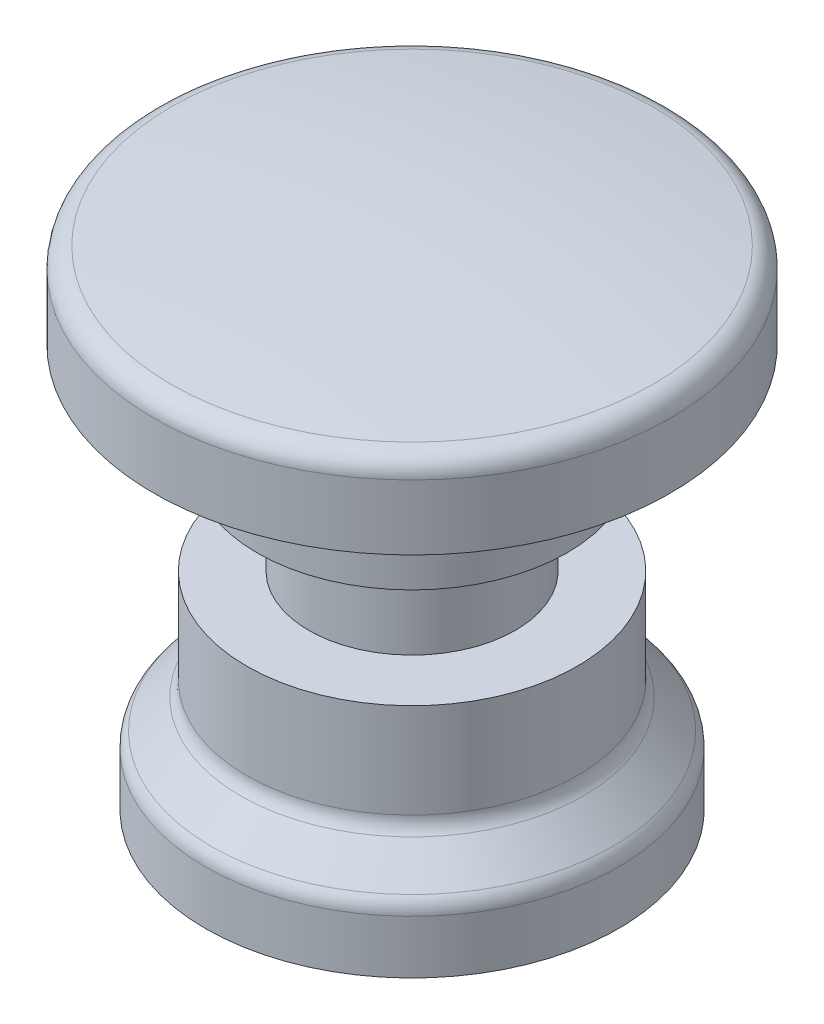
ISO-10303-21;
HEADER;
FILE_DESCRIPTION(('STEP AP214'),'2;1');
FILE_NAME('part.step','',(''),(''),'','','');
FILE_SCHEMA(('AUTOMOTIVE_DESIGN { 1 0 10303 214 1 1 1 1 }'));
ENDSEC;
DATA;
#1=APPLICATION_CONTEXT('core data for automotive mechanical design processes');
#2=APPLICATION_PROTOCOL_DEFINITION('international standard','automotive_design',2000,#1);
#3=PRODUCT_CONTEXT('',#1,'mechanical');
#4=PRODUCT('Part','Part','',(#3));
#5=PRODUCT_RELATED_PRODUCT_CATEGORY('part','',(#4));
#6=PRODUCT_DEFINITION_FORMATION('','',#4);
#7=PRODUCT_DEFINITION_CONTEXT('part definition',#1,'design');
#8=PRODUCT_DEFINITION('design','',#6,#7);
#9=PRODUCT_DEFINITION_SHAPE('','',#8);
#10=(LENGTH_UNIT() NAMED_UNIT(*) SI_UNIT(.MILLI.,.METRE.));
#11=(NAMED_UNIT(*) PLANE_ANGLE_UNIT() SI_UNIT($,.RADIAN.));
#12=(NAMED_UNIT(*) SI_UNIT($,.STERADIAN.) SOLID_ANGLE_UNIT());
#13=UNCERTAINTY_MEASURE_WITH_UNIT(LENGTH_MEASURE(1.E-05),#10,'distance_accuracy_value','');
#14=(GEOMETRIC_REPRESENTATION_CONTEXT(3) GLOBAL_UNCERTAINTY_ASSIGNED_CONTEXT((#13)) GLOBAL_UNIT_ASSIGNED_CONTEXT((#10,
#11,#12)) REPRESENTATION_CONTEXT('',''));
#15=CARTESIAN_POINT('',(0.,0.,0.));
#16=DIRECTION('',(0.,0.,1.));
#17=DIRECTION('',(1.,0.,0.));
#18=AXIS2_PLACEMENT_3D('',#15,#16,#17);
#19=CARTESIAN_POINT('',(0.,-54.125,0.));
#20=DIRECTION('',(0.,0.,1.));
#21=DIRECTION('',(1.,0.,0.));
#22=AXIS2_PLACEMENT_3D('',#19,#20,#21);
#23=SPHERICAL_SURFACE('',#22,78.625);
#24=CARTESIAN_POINT('',(0.,-54.125,0.));
#25=DIRECTION('',(0.,-1.,0.));
#26=DIRECTION('',(0.,0.,-1.));
#27=AXIS2_PLACEMENT_3D('',#24,#25,#26);
#28=SPHERICAL_SURFACE('',#27,78.625);
#29=CARTESIAN_POINT('',(0.,23.6323872356755,0.));
#30=DIRECTION('',(0.,-1.,0.));
#31=DIRECTION('',(0.,0.,-1.));
#32=AXIS2_PLACEMENT_3D('',#29,#30,#31);
#33=CIRCLE('',#32,11.6481481481481);
#34=CARTESIAN_POINT('',(0.,23.6323872356755,-11.6481481481481));
#35=VERTEX_POINT('',#34);
#36=EDGE_CURVE('E10',#35,#35,#33,.F.);
#37=ORIENTED_EDGE('',*,*,#36,.T.);
#38=EDGE_LOOP('',(#37));
#39=FACE_BOUND('',#38,.T.);
#40=ADVANCED_FACE('F31',(#39),#28,.T.);
#41=CARTESIAN_POINT('',(0.,0.,0.));
#42=DIRECTION('',(0.,-1.,0.));
#43=DIRECTION('',(0.,0.,-1.));
#44=AXIS2_PLACEMENT_3D('',#41,#42,#43);
#45=CYLINDRICAL_SURFACE('',#44,12.5);
#46=CARTESIAN_POINT('',(0.,22.6434220562075,0.));
#47=DIRECTION('',(0.,-1.,0.));
#48=DIRECTION('',(0.,0.,-1.));
#49=AXIS2_PLACEMENT_3D('',#46,#47,#48);
#50=CIRCLE('',#49,12.5);
#51=CARTESIAN_POINT('',(0.,22.6434220562075,-12.5));
#52=VERTEX_POINT('',#51);
#53=EDGE_CURVE('E38',#52,#52,#50,.T.);
#54=ORIENTED_EDGE('',*,*,#53,.T.);
#55=EDGE_LOOP('',(#54));
#56=FACE_BOUND('',#55,.T.);
#57=CARTESIAN_POINT('',(0.,19.5,0.));
#58=DIRECTION('',(0.,-1.,0.));
#59=DIRECTION('',(0.,0.,-1.));
#60=AXIS2_PLACEMENT_3D('',#57,#58,#59);
#61=CIRCLE('',#60,12.5);
#62=CARTESIAN_POINT('',(0.,19.5,-12.5));
#63=VERTEX_POINT('',#62);
#64=EDGE_CURVE('E57',#63,#63,#61,.T.);
#65=ORIENTED_EDGE('',*,*,#64,.F.);
#66=EDGE_LOOP('',(#65));
#67=FACE_BOUND('',#66,.T.);
#68=ADVANCED_FACE('F96',(#56,#67),#45,.T.);
#69=CARTESIAN_POINT('',(12.5,19.5,0.));
#70=DIRECTION('',(0.,-1.,0.));
#71=DIRECTION('',(0.,0.,-1.));
#72=AXIS2_PLACEMENT_3D('',#69,#70,#71);
#73=PLANE('',#72);
#74=ORIENTED_EDGE('',*,*,#64,.T.);
#75=EDGE_LOOP('',(#74));
#76=FACE_BOUND('',#75,.T.);
#77=CARTESIAN_POINT('',(0.,19.5,0.));
#78=DIRECTION('',(0.,-1.,0.));
#79=DIRECTION('',(0.,0.,-1.));
#80=AXIS2_PLACEMENT_3D('',#77,#78,#79);
#81=CIRCLE('',#80,7.5);
#82=CARTESIAN_POINT('',(0.,19.5,-7.5));
#83=VERTEX_POINT('',#82);
#84=EDGE_CURVE('E60',#83,#83,#81,.T.);
#85=ORIENTED_EDGE('',*,*,#84,.F.);
#86=EDGE_LOOP('',(#85));
#87=FACE_BOUND('',#86,.T.);
#88=ADVANCED_FACE('F101',(#76,#87),#73,.T.);
#89=CARTESIAN_POINT('',(0.,0.,0.));
#90=DIRECTION('',(0.,-1.,0.));
#91=DIRECTION('',(0.,0.,-1.));
#92=AXIS2_PLACEMENT_3D('',#89,#90,#91);
#93=CYLINDRICAL_SURFACE('',#92,7.5);
#94=ORIENTED_EDGE('',*,*,#84,.T.);
#95=EDGE_LOOP('',(#94));
#96=FACE_BOUND('',#95,.T.);
#97=CARTESIAN_POINT('',(0.,14.5,0.));
#98=DIRECTION('',(0.,-1.,0.));
#99=DIRECTION('',(0.,0.,-1.));
#100=AXIS2_PLACEMENT_3D('',#97,#98,#99);
#101=CIRCLE('',#100,7.5);
#102=CARTESIAN_POINT('',(0.,14.5,-7.5));
#103=VERTEX_POINT('',#102);
#104=EDGE_CURVE('E63',#103,#103,#101,.T.);
#105=ORIENTED_EDGE('',*,*,#104,.F.);
#106=EDGE_LOOP('',(#105));
#107=FACE_BOUND('',#106,.T.);
#108=ADVANCED_FACE('F138',(#96,#107),#93,.T.);
#109=CARTESIAN_POINT('',(7.5,14.5,0.));
#110=DIRECTION('',(0.,-1.,0.));
#111=DIRECTION('',(0.,0.,-1.));
#112=AXIS2_PLACEMENT_3D('',#109,#110,#111);
#113=PLANE('',#112);
#114=ORIENTED_EDGE('',*,*,#104,.T.);
#115=EDGE_LOOP('',(#114));
#116=FACE_BOUND('',#115,.T.);
#117=CARTESIAN_POINT('',(0.,14.5,0.));
#118=DIRECTION('',(0.,-1.,0.));
#119=DIRECTION('',(0.,0.,-1.));
#120=AXIS2_PLACEMENT_3D('',#117,#118,#119);
#121=CIRCLE('',#120,5.);
#122=CARTESIAN_POINT('',(0.,14.5,-5.));
#123=VERTEX_POINT('',#122);
#124=EDGE_CURVE('E66',#123,#123,#121,.T.);
#125=ORIENTED_EDGE('',*,*,#124,.F.);
#126=EDGE_LOOP('',(#125));
#127=FACE_BOUND('',#126,.T.);
#128=ADVANCED_FACE('F132',(#116,#127),#113,.T.);
#129=CARTESIAN_POINT('',(0.,0.,0.));
#130=DIRECTION('',(0.,-1.,0.));
#131=DIRECTION('',(0.,0.,-1.));
#132=AXIS2_PLACEMENT_3D('',#129,#130,#131);
#133=CYLINDRICAL_SURFACE('',#132,5.);
#134=ORIENTED_EDGE('',*,*,#124,.T.);
#135=EDGE_LOOP('',(#134));
#136=FACE_BOUND('',#135,.T.);
#137=CARTESIAN_POINT('',(0.,9.99999999999998,0.));
#138=DIRECTION('',(0.,-1.,0.));
#139=DIRECTION('',(0.,0.,-1.));
#140=AXIS2_PLACEMENT_3D('',#137,#138,#139);
#141=CIRCLE('',#140,5.);
#142=CARTESIAN_POINT('',(0.,9.99999999999998,-5.));
#143=VERTEX_POINT('',#142);
#144=EDGE_CURVE('E69',#143,#143,#141,.T.);
#145=ORIENTED_EDGE('',*,*,#144,.F.);
#146=EDGE_LOOP('',(#145));
#147=FACE_BOUND('',#146,.T.);
#148=ADVANCED_FACE('F126',(#136,#147),#133,.T.);
#149=CARTESIAN_POINT('',(5.,9.99999999999998,0.));
#150=DIRECTION('',(0.,1.,0.));
#151=DIRECTION('',(0.,0.,1.));
#152=AXIS2_PLACEMENT_3D('',#149,#150,#151);
#153=PLANE('',#152);
#154=ORIENTED_EDGE('',*,*,#144,.T.);
#155=EDGE_LOOP('',(#154));
#156=FACE_BOUND('',#155,.T.);
#157=CARTESIAN_POINT('',(0.,9.99999999999998,0.));
#158=DIRECTION('',(0.,-1.,0.));
#159=DIRECTION('',(0.,0.,-1.));
#160=AXIS2_PLACEMENT_3D('',#157,#158,#159);
#161=CIRCLE('',#160,8.);
#162=CARTESIAN_POINT('',(0.,9.99999999999998,-8.));
#163=VERTEX_POINT('',#162);
#164=EDGE_CURVE('E72',#163,#163,#161,.T.);
#165=ORIENTED_EDGE('',*,*,#164,.F.);
#166=EDGE_LOOP('',(#165));
#167=FACE_BOUND('',#166,.T.);
#168=ADVANCED_FACE('F121',(#156,#167),#153,.T.);
#169=CARTESIAN_POINT('',(0.,0.,0.));
#170=DIRECTION('',(0.,-1.,0.));
#171=DIRECTION('',(0.,0.,-1.));
#172=AXIS2_PLACEMENT_3D('',#169,#170,#171);
#173=CYLINDRICAL_SURFACE('',#172,8.);
#174=CARTESIAN_POINT('',(0.,5.41421356237308,0.));
#175=DIRECTION('',(0.,-1.,0.));
#176=DIRECTION('',(0.,0.,-1.));
#177=AXIS2_PLACEMENT_3D('',#174,#175,#176);
#178=CIRCLE('',#177,8.);
#179=CARTESIAN_POINT('',(0.,5.41421356237308,-8.));
#180=VERTEX_POINT('',#179);
#181=EDGE_CURVE('E42',#180,#180,#178,.F.);
#182=ORIENTED_EDGE('',*,*,#181,.T.);
#183=EDGE_LOOP('',(#182));
#184=FACE_BOUND('',#183,.T.);
#185=ORIENTED_EDGE('',*,*,#164,.T.);
#186=EDGE_LOOP('',(#185));
#187=FACE_BOUND('',#186,.T.);
#188=ADVANCED_FACE('F92',(#184,#187),#173,.T.);
#189=CARTESIAN_POINT('',(0.,3.,0.));
#190=DIRECTION('',(0.,-1.,0.));
#191=DIRECTION('',(0.,0.,-1.));
#192=AXIS2_PLACEMENT_3D('',#189,#190,#191);
#193=CONICAL_SURFACE('',#192,10.,0.785398163397454);
#194=CARTESIAN_POINT('',(0.,3.29289321881346,0.));
#195=DIRECTION('',(0.,1.,0.));
#196=DIRECTION('',(0.,0.,1.));
#197=AXIS2_PLACEMENT_3D('',#194,#195,#196);
#198=CIRCLE('',#197,9.70710678118654);
#199=CARTESIAN_POINT('',(0.,3.29289321881346,9.70710678118654));
#200=VERTEX_POINT('',#199);
#201=EDGE_CURVE('E46',#200,#200,#198,.T.);
#202=ORIENTED_EDGE('',*,*,#201,.T.);
#203=EDGE_LOOP('',(#202));
#204=FACE_BOUND('',#203,.T.);
#205=CARTESIAN_POINT('',(0.,4.70710678118653,0.));
#206=DIRECTION('',(0.,-1.,0.));
#207=DIRECTION('',(0.,0.,-1.));
#208=AXIS2_PLACEMENT_3D('',#205,#206,#207);
#209=CIRCLE('',#208,8.29289321881346);
#210=CARTESIAN_POINT('',(0.,4.70710678118653,-8.29289321881346));
#211=VERTEX_POINT('',#210);
#212=EDGE_CURVE('E51',#211,#211,#209,.T.);
#213=ORIENTED_EDGE('',*,*,#212,.T.);
#214=EDGE_LOOP('',(#213));
#215=FACE_BOUND('',#214,.T.);
#216=ADVANCED_FACE('F83',(#204,#215),#193,.T.);
#217=CARTESIAN_POINT('',(0.,0.,0.));
#218=DIRECTION('',(0.,-1.,0.));
#219=DIRECTION('',(0.,0.,-1.));
#220=AXIS2_PLACEMENT_3D('',#217,#218,#219);
#221=CYLINDRICAL_SURFACE('',#220,10.);
#222=CARTESIAN_POINT('',(0.,2.5857864376269,0.));
#223=DIRECTION('',(0.,1.,0.));
#224=DIRECTION('',(0.,0.,1.));
#225=AXIS2_PLACEMENT_3D('',#222,#223,#224);
#226=CIRCLE('',#225,10.);
#227=CARTESIAN_POINT('',(0.,2.5857864376269,10.));
#228=VERTEX_POINT('',#227);
#229=EDGE_CURVE('E54',#228,#228,#226,.F.);
#230=ORIENTED_EDGE('',*,*,#229,.T.);
#231=EDGE_LOOP('',(#230));
#232=FACE_BOUND('',#231,.T.);
#233=CARTESIAN_POINT('',(0.,0.,0.));
#234=DIRECTION('',(0.,-1.,0.));
#235=DIRECTION('',(0.,0.,-1.));
#236=AXIS2_PLACEMENT_3D('',#233,#234,#235);
#237=CIRCLE('',#236,10.);
#238=CARTESIAN_POINT('',(0.,0.,-10.));
#239=VERTEX_POINT('',#238);
#240=EDGE_CURVE('E75',#239,#239,#237,.T.);
#241=ORIENTED_EDGE('',*,*,#240,.F.);
#242=EDGE_LOOP('',(#241));
#243=FACE_BOUND('',#242,.T.);
#244=ADVANCED_FACE('F81',(#232,#243),#221,.T.);
#245=CARTESIAN_POINT('',(10.,0.,0.));
#246=DIRECTION('',(0.,-1.,0.));
#247=DIRECTION('',(0.,0.,-1.));
#248=AXIS2_PLACEMENT_3D('',#245,#246,#247);
#249=PLANE('',#248);
#250=ORIENTED_EDGE('',*,*,#240,.T.);
#251=EDGE_LOOP('',(#250));
#252=FACE_BOUND('',#251,.T.);
#253=ADVANCED_FACE('F79',(#252),#249,.T.);
#254=CARTESIAN_POINT('',(0.,2.5857864376269,0.));
#255=DIRECTION('',(0.,1.,0.));
#256=DIRECTION('',(0.,0.,1.));
#257=AXIS2_PLACEMENT_3D('',#254,#255,#256);
#258=TOROIDAL_SURFACE('',#257,9.,1.);
#259=ORIENTED_EDGE('',*,*,#201,.F.);
#260=EDGE_LOOP('',(#259));
#261=FACE_BOUND('',#260,.T.);
#262=ORIENTED_EDGE('',*,*,#229,.F.);
#263=EDGE_LOOP('',(#262));
#264=FACE_BOUND('',#263,.T.);
#265=ADVANCED_FACE('F90',(#261,#264),#258,.T.);
#266=CARTESIAN_POINT('',(0.,5.41421356237308,0.));
#267=DIRECTION('',(0.,-1.,0.));
#268=DIRECTION('',(0.,0.,-1.));
#269=AXIS2_PLACEMENT_3D('',#266,#267,#268);
#270=TOROIDAL_SURFACE('',#269,9.,1.);
#271=ORIENTED_EDGE('',*,*,#181,.F.);
#272=EDGE_LOOP('',(#271));
#273=FACE_BOUND('',#272,.T.);
#274=ORIENTED_EDGE('',*,*,#212,.F.);
#275=EDGE_LOOP('',(#274));
#276=FACE_BOUND('',#275,.T.);
#277=ADVANCED_FACE('F106',(#273,#276),#270,.F.);
#278=CARTESIAN_POINT('',(0.,22.6434220562075,0.));
#279=DIRECTION('',(0.,-1.,0.));
#280=DIRECTION('',(0.,0.,-1.));
#281=AXIS2_PLACEMENT_3D('',#278,#279,#280);
#282=TOROIDAL_SURFACE('',#281,11.5,1.);
#283=ORIENTED_EDGE('',*,*,#36,.F.);
#284=EDGE_LOOP('',(#283));
#285=FACE_BOUND('',#284,.T.);
#286=ORIENTED_EDGE('',*,*,#53,.F.);
#287=EDGE_LOOP('',(#286));
#288=FACE_BOUND('',#287,.T.);
#289=ADVANCED_FACE('F33',(#285,#288),#282,.T.);
#290=CLOSED_SHELL('',(#40,#68,#88,#108,#128,#148,#168,#188,#216,#244,#253,#265,#277,#289));
#291=MANIFOLD_SOLID_BREP('B2',#290);
#292=ADVANCED_BREP_SHAPE_REPRESENTATION('',(#18,#291),#14);
#293=SHAPE_DEFINITION_REPRESENTATION(#9,#292);
ENDSEC;
END-ISO-10303-21;
